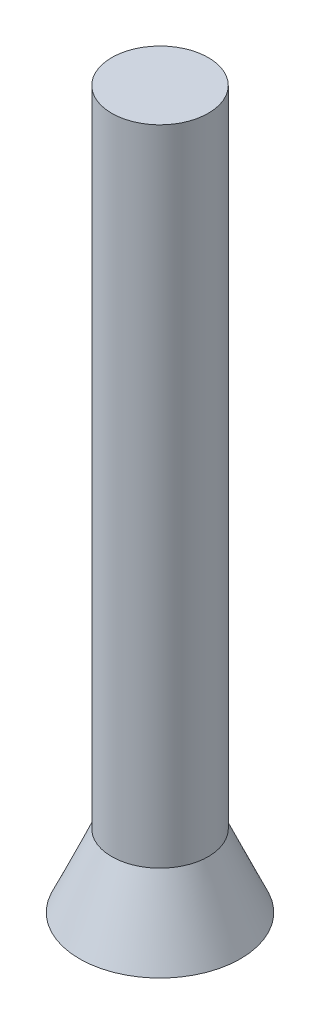
ISO-10303-21;
HEADER;
FILE_DESCRIPTION(('STEP AP214'),'2;1');
FILE_NAME('part.step','',(''),(''),'','','');
FILE_SCHEMA(('AUTOMOTIVE_DESIGN { 1 0 10303 214 1 1 1 1 }'));
ENDSEC;
DATA;
#1=APPLICATION_CONTEXT('core data for automotive mechanical design processes');
#2=APPLICATION_PROTOCOL_DEFINITION('international standard','automotive_design',2000,#1);
#3=PRODUCT_CONTEXT('',#1,'mechanical');
#4=PRODUCT('Part','Part','',(#3));
#5=PRODUCT_RELATED_PRODUCT_CATEGORY('part','',(#4));
#6=PRODUCT_DEFINITION_FORMATION('','',#4);
#7=PRODUCT_DEFINITION_CONTEXT('part definition',#1,'design');
#8=PRODUCT_DEFINITION('design','',#6,#7);
#9=PRODUCT_DEFINITION_SHAPE('','',#8);
#10=(LENGTH_UNIT() NAMED_UNIT(*) SI_UNIT(.MILLI.,.METRE.));
#11=(NAMED_UNIT(*) PLANE_ANGLE_UNIT() SI_UNIT($,.RADIAN.));
#12=(NAMED_UNIT(*) SI_UNIT($,.STERADIAN.) SOLID_ANGLE_UNIT());
#13=UNCERTAINTY_MEASURE_WITH_UNIT(LENGTH_MEASURE(1.E-05),#10,'distance_accuracy_value','');
#14=(GEOMETRIC_REPRESENTATION_CONTEXT(3) GLOBAL_UNCERTAINTY_ASSIGNED_CONTEXT((#13)) GLOBAL_UNIT_ASSIGNED_CONTEXT((#10,
#11,#12)) REPRESENTATION_CONTEXT('',''));
#15=CARTESIAN_POINT('',(0.,0.,0.));
#16=DIRECTION('',(0.,0.,1.));
#17=DIRECTION('',(1.,0.,0.));
#18=AXIS2_PLACEMENT_3D('',#15,#16,#17);
#19=CARTESIAN_POINT('',(0.,0.,0.));
#20=DIRECTION('',(0.,-1.,0.));
#21=DIRECTION('',(0.,0.,1.));
#22=AXIS2_PLACEMENT_3D('',#19,#20,#21);
#23=CONICAL_SURFACE('',#22,2.5,0.41887902047864);
#24=CARTESIAN_POINT('',(0.,2.25,0.));
#25=DIRECTION('',(0.,1.,0.));
#26=DIRECTION('',(0.,0.,1.));
#27=AXIS2_PLACEMENT_3D('',#24,#25,#26);
#28=CIRCLE('',#27,1.5);
#29=CARTESIAN_POINT('',(0.,2.25,1.5));
#30=VERTEX_POINT('',#29);
#31=EDGE_CURVE('E11',#30,#30,#28,.T.);
#32=ORIENTED_EDGE('',*,*,#31,.F.);
#33=EDGE_LOOP('',(#32));
#34=FACE_BOUND('',#33,.T.);
#35=CARTESIAN_POINT('',(0.,0.,0.));
#36=DIRECTION('',(0.,1.,0.));
#37=DIRECTION('',(0.,0.,1.));
#38=AXIS2_PLACEMENT_3D('',#35,#36,#37);
#39=CIRCLE('',#38,2.5);
#40=CARTESIAN_POINT('',(0.,0.,2.5));
#41=VERTEX_POINT('',#40);
#42=EDGE_CURVE('E43',#41,#41,#39,.T.);
#43=ORIENTED_EDGE('',*,*,#42,.T.);
#44=EDGE_LOOP('',(#43));
#45=FACE_BOUND('',#44,.T.);
#46=ADVANCED_FACE('F33',(#34,#45),#23,.T.);
#47=CARTESIAN_POINT('',(0.,0.,0.));
#48=DIRECTION('',(0.,1.,0.));
#49=DIRECTION('',(0.,0.,1.));
#50=AXIS2_PLACEMENT_3D('',#47,#48,#49);
#51=PLANE('',#50);
#52=DIRECTION('',(0.,0.,1.));
#53=VECTOR('',#52,1.);
#54=CARTESIAN_POINT('',(0.5,0.,-0.5));
#55=LINE('',#54,#53);
#56=CARTESIAN_POINT('',(0.5,0.,-2.));
#57=VERTEX_POINT('',#56);
#58=CARTESIAN_POINT('',(0.5,0.,-0.5));
#59=VERTEX_POINT('',#58);
#60=EDGE_CURVE('E142',#57,#59,#55,.T.);
#61=ORIENTED_EDGE('',*,*,#60,.F.);
#62=DIRECTION('',(1.,0.,0.));
#63=VECTOR('',#62,1.);
#64=CARTESIAN_POINT('',(-0.5,0.,-2.));
#65=LINE('',#64,#63);
#66=CARTESIAN_POINT('',(-0.5,0.,-2.));
#67=VERTEX_POINT('',#66);
#68=EDGE_CURVE('E50',#67,#57,#65,.T.);
#69=ORIENTED_EDGE('',*,*,#68,.F.);
#70=DIRECTION('',(0.,0.,-1.));
#71=VECTOR('',#70,1.);
#72=CARTESIAN_POINT('',(-0.5,0.,-0.5));
#73=LINE('',#72,#71);
#74=CARTESIAN_POINT('',(-0.5,0.,-0.5));
#75=VERTEX_POINT('',#74);
#76=EDGE_CURVE('E175',#75,#67,#73,.T.);
#77=ORIENTED_EDGE('',*,*,#76,.F.);
#78=DIRECTION('',(1.,0.,0.));
#79=VECTOR('',#78,1.);
#80=CARTESIAN_POINT('',(-2.,0.,-0.5));
#81=LINE('',#80,#79);
#82=CARTESIAN_POINT('',(-2.,0.,-0.5));
#83=VERTEX_POINT('',#82);
#84=EDGE_CURVE('E173',#83,#75,#81,.T.);
#85=ORIENTED_EDGE('',*,*,#84,.F.);
#86=DIRECTION('',(0.,0.,-1.));
#87=VECTOR('',#86,1.);
#88=CARTESIAN_POINT('',(-2.,0.,0.5));
#89=LINE('',#88,#87);
#90=CARTESIAN_POINT('',(-2.,0.,0.5));
#91=VERTEX_POINT('',#90);
#92=EDGE_CURVE('E170',#91,#83,#89,.T.);
#93=ORIENTED_EDGE('',*,*,#92,.F.);
#94=DIRECTION('',(-1.,0.,0.));
#95=VECTOR('',#94,1.);
#96=CARTESIAN_POINT('',(-2.,0.,0.5));
#97=LINE('',#96,#95);
#98=CARTESIAN_POINT('',(-0.5,0.,0.5));
#99=VERTEX_POINT('',#98);
#100=EDGE_CURVE('E167',#99,#91,#97,.T.);
#101=ORIENTED_EDGE('',*,*,#100,.F.);
#102=DIRECTION('',(0.,0.,-1.));
#103=VECTOR('',#102,1.);
#104=CARTESIAN_POINT('',(-0.5,0.,2.));
#105=LINE('',#104,#103);
#106=CARTESIAN_POINT('',(-0.5,0.,2.));
#107=VERTEX_POINT('',#106);
#108=EDGE_CURVE('E164',#107,#99,#105,.T.);
#109=ORIENTED_EDGE('',*,*,#108,.F.);
#110=DIRECTION('',(-1.,0.,0.));
#111=VECTOR('',#110,1.);
#112=CARTESIAN_POINT('',(-0.5,0.,2.));
#113=LINE('',#112,#111);
#114=CARTESIAN_POINT('',(0.5,0.,2.));
#115=VERTEX_POINT('',#114);
#116=EDGE_CURVE('E161',#115,#107,#113,.T.);
#117=ORIENTED_EDGE('',*,*,#116,.F.);
#118=DIRECTION('',(0.,0.,1.));
#119=VECTOR('',#118,1.);
#120=CARTESIAN_POINT('',(0.5,0.,2.));
#121=LINE('',#120,#119);
#122=CARTESIAN_POINT('',(0.5,0.,0.5));
#123=VERTEX_POINT('',#122);
#124=EDGE_CURVE('E158',#123,#115,#121,.T.);
#125=ORIENTED_EDGE('',*,*,#124,.F.);
#126=DIRECTION('',(-1.,0.,0.));
#127=VECTOR('',#126,1.);
#128=CARTESIAN_POINT('',(0.5,0.,0.5));
#129=LINE('',#128,#127);
#130=CARTESIAN_POINT('',(2.,0.,0.5));
#131=VERTEX_POINT('',#130);
#132=EDGE_CURVE('E152',#131,#123,#129,.T.);
#133=ORIENTED_EDGE('',*,*,#132,.F.);
#134=DIRECTION('',(0.,0.,1.));
#135=VECTOR('',#134,1.);
#136=CARTESIAN_POINT('',(2.,0.,0.5));
#137=LINE('',#136,#135);
#138=CARTESIAN_POINT('',(2.,0.,-0.5));
#139=VERTEX_POINT('',#138);
#140=EDGE_CURVE('E150',#139,#131,#137,.T.);
#141=ORIENTED_EDGE('',*,*,#140,.F.);
#142=DIRECTION('',(1.,0.,0.));
#143=VECTOR('',#142,1.);
#144=CARTESIAN_POINT('',(0.5,0.,-0.5));
#145=LINE('',#144,#143);
#146=EDGE_CURVE('E133',#59,#139,#145,.T.);
#147=ORIENTED_EDGE('',*,*,#146,.F.);
#148=EDGE_LOOP('',(#61,#69,#77,#85,#93,#101,#109,#117,#125,#133,#141,#147));
#149=FACE_BOUND('',#148,.T.);
#150=ORIENTED_EDGE('',*,*,#42,.F.);
#151=EDGE_LOOP('',(#150));
#152=FACE_BOUND('',#151,.T.);
#153=ADVANCED_FACE('F146',(#149,#152),#51,.F.);
#154=CARTESIAN_POINT('',(0.,22.25,0.));
#155=DIRECTION('',(0.,-1.,0.));
#156=DIRECTION('',(0.,0.,-1.));
#157=AXIS2_PLACEMENT_3D('',#154,#155,#156);
#158=CYLINDRICAL_SURFACE('',#157,1.5);
#159=CARTESIAN_POINT('',(0.,22.25,0.));
#160=DIRECTION('',(0.,1.,0.));
#161=DIRECTION('',(0.,0.,1.));
#162=AXIS2_PLACEMENT_3D('',#159,#160,#161);
#163=CIRCLE('',#162,1.5);
#164=CARTESIAN_POINT('',(0.,22.25,1.5));
#165=VERTEX_POINT('',#164);
#166=EDGE_CURVE('E179',#165,#165,#163,.T.);
#167=ORIENTED_EDGE('',*,*,#166,.F.);
#168=EDGE_LOOP('',(#167));
#169=FACE_BOUND('',#168,.T.);
#170=ORIENTED_EDGE('',*,*,#31,.T.);
#171=EDGE_LOOP('',(#170));
#172=FACE_BOUND('',#171,.T.);
#173=ADVANCED_FACE('F238',(#169,#172),#158,.T.);
#174=CARTESIAN_POINT('',(0.,22.25,0.));
#175=DIRECTION('',(0.,1.,0.));
#176=DIRECTION('',(0.,0.,1.));
#177=AXIS2_PLACEMENT_3D('',#174,#175,#176);
#178=PLANE('',#177);
#179=ORIENTED_EDGE('',*,*,#166,.T.);
#180=EDGE_LOOP('',(#179));
#181=FACE_BOUND('',#180,.T.);
#182=ADVANCED_FACE('F247',(#181),#178,.T.);
#183=CARTESIAN_POINT('',(-0.5,0.,-2.));
#184=DIRECTION('',(0.,0.284015344703923,-0.958819734868193));
#185=DIRECTION('',(0.,0.958819734868193,0.284015344703923));
#186=AXIS2_PLACEMENT_3D('',#183,#184,#185);
#187=PLANE('',#186);
#188=ORIENTED_EDGE('',*,*,#68,.T.);
#189=DIRECTION('',(0.273209828505095,-0.922340923529056,-0.273209828505095));
#190=VECTOR('',#189,1.);
#191=CARTESIAN_POINT('',(0.425356389608217,0.251992605540605,-1.92535638960822));
#192=LINE('',#191,#190);
#193=CARTESIAN_POINT('',(0.0556797575568785,1.5,-1.55567975755688));
#194=VERTEX_POINT('',#193);
#195=EDGE_CURVE('E93',#194,#57,#192,.T.);
#196=ORIENTED_EDGE('',*,*,#195,.F.);
#197=DIRECTION('',(1.,0.,0.));
#198=VECTOR('',#197,1.);
#199=CARTESIAN_POINT('',(-0.5,1.5,-1.55567975755688));
#200=LINE('',#199,#198);
#201=CARTESIAN_POINT('',(-0.0556797575568784,1.5,-1.55567975755688));
#202=VERTEX_POINT('',#201);
#203=EDGE_CURVE('E177',#202,#194,#200,.T.);
#204=ORIENTED_EDGE('',*,*,#203,.F.);
#205=DIRECTION('',(-0.273209828505095,-0.922340923529056,-0.273209828505095));
#206=VECTOR('',#205,1.);
#207=CARTESIAN_POINT('',(-0.388034584412325,0.377988908310907,-1.88803458441232));
#208=LINE('',#207,#206);
#209=EDGE_CURVE('E58',#202,#67,#208,.T.);
#210=ORIENTED_EDGE('',*,*,#209,.T.);
#211=EDGE_LOOP('',(#188,#196,#204,#210));
#212=FACE_BOUND('',#211,.T.);
#213=ADVANCED_FACE('F275',(#212),#187,.F.);
#214=CARTESIAN_POINT('',(-0.5,0.,-0.5));
#215=DIRECTION('',(-0.958819734868193,0.284015344703923,0.));
#216=DIRECTION('',(-0.284015344703923,-0.958819734868193,0.));
#217=AXIS2_PLACEMENT_3D('',#214,#215,#216);
#218=PLANE('',#217);
#219=ORIENTED_EDGE('',*,*,#76,.T.);
#220=ORIENTED_EDGE('',*,*,#209,.F.);
#221=DIRECTION('',(0.,0.,-1.));
#222=VECTOR('',#221,1.);
#223=CARTESIAN_POINT('',(-0.0556797575568785,1.5,-0.5));
#224=LINE('',#223,#222);
#225=CARTESIAN_POINT('',(-0.0556797575568785,1.5,-0.0556797575568784));
#226=VERTEX_POINT('',#225);
#227=EDGE_CURVE('E180',#226,#202,#224,.T.);
#228=ORIENTED_EDGE('',*,*,#227,.F.);
#229=DIRECTION('',(-0.273209828505095,-0.922340923529056,-0.273209828505095));
#230=VECTOR('',#229,1.);
#231=CARTESIAN_POINT('',(-0.5,0.,-0.5));
#232=LINE('',#231,#230);
#233=EDGE_CURVE('E98',#226,#75,#232,.T.);
#234=ORIENTED_EDGE('',*,*,#233,.T.);
#235=EDGE_LOOP('',(#219,#220,#228,#234));
#236=FACE_BOUND('',#235,.T.);
#237=ADVANCED_FACE('F288',(#236),#218,.F.);
#238=CARTESIAN_POINT('',(-2.,0.,-0.5));
#239=DIRECTION('',(0.,0.284015344703923,-0.958819734868193));
#240=DIRECTION('',(0.,0.958819734868193,0.284015344703923));
#241=AXIS2_PLACEMENT_3D('',#238,#239,#240);
#242=PLANE('',#241);
#243=ORIENTED_EDGE('',*,*,#84,.T.);
#244=ORIENTED_EDGE('',*,*,#233,.F.);
#245=DIRECTION('',(1.,0.,0.));
#246=VECTOR('',#245,1.);
#247=CARTESIAN_POINT('',(-2.,1.5,-0.0556797575568787));
#248=LINE('',#247,#246);
#249=CARTESIAN_POINT('',(-1.55567975755688,1.5,-0.0556797575568787));
#250=VERTEX_POINT('',#249);
#251=EDGE_CURVE('E203',#250,#226,#248,.T.);
#252=ORIENTED_EDGE('',*,*,#251,.F.);
#253=DIRECTION('',(-0.273209828505095,-0.922340923529056,-0.273209828505095));
#254=VECTOR('',#253,1.);
#255=CARTESIAN_POINT('',(-1.92535638960822,0.251992605540605,-0.425356389608217));
#256=LINE('',#255,#254);
#257=EDGE_CURVE('E195',#250,#83,#256,.T.);
#258=ORIENTED_EDGE('',*,*,#257,.T.);
#259=EDGE_LOOP('',(#243,#244,#252,#258));
#260=FACE_BOUND('',#259,.T.);
#261=ADVANCED_FACE('F297',(#260),#242,.F.);
#262=CARTESIAN_POINT('',(-2.,0.,0.5));
#263=DIRECTION('',(-0.958819734868193,0.284015344703923,0.));
#264=DIRECTION('',(-0.284015344703923,-0.958819734868193,0.));
#265=AXIS2_PLACEMENT_3D('',#262,#263,#264);
#266=PLANE('',#265);
#267=ORIENTED_EDGE('',*,*,#92,.T.);
#268=ORIENTED_EDGE('',*,*,#257,.F.);
#269=DIRECTION('',(0.,0.,-1.));
#270=VECTOR('',#269,1.);
#271=CARTESIAN_POINT('',(-1.55567975755688,1.5,0.5));
#272=LINE('',#271,#270);
#273=CARTESIAN_POINT('',(-1.55567975755688,1.5,0.0556797575568783));
#274=VERTEX_POINT('',#273);
#275=EDGE_CURVE('E206',#274,#250,#272,.T.);
#276=ORIENTED_EDGE('',*,*,#275,.F.);
#277=DIRECTION('',(-0.273209828505095,-0.922340923529056,0.273209828505095));
#278=VECTOR('',#277,1.);
#279=CARTESIAN_POINT('',(-2.,0.,0.5));
#280=LINE('',#279,#278);
#281=EDGE_CURVE('E193',#274,#91,#280,.T.);
#282=ORIENTED_EDGE('',*,*,#281,.T.);
#283=EDGE_LOOP('',(#267,#268,#276,#282));
#284=FACE_BOUND('',#283,.T.);
#285=ADVANCED_FACE('F305',(#284),#266,.F.);
#286=CARTESIAN_POINT('',(-2.,0.,0.5));
#287=DIRECTION('',(0.,0.284015344703923,0.958819734868193));
#288=DIRECTION('',(0.,-0.958819734868193,0.284015344703923));
#289=AXIS2_PLACEMENT_3D('',#286,#287,#288);
#290=PLANE('',#289);
#291=ORIENTED_EDGE('',*,*,#100,.T.);
#292=ORIENTED_EDGE('',*,*,#281,.F.);
#293=DIRECTION('',(-1.,0.,0.));
#294=VECTOR('',#293,1.);
#295=CARTESIAN_POINT('',(-2.,1.5,0.0556797575568783));
#296=LINE('',#295,#294);
#297=CARTESIAN_POINT('',(-0.0556797575568785,1.5,0.0556797575568785));
#298=VERTEX_POINT('',#297);
#299=EDGE_CURVE('E209',#298,#274,#296,.T.);
#300=ORIENTED_EDGE('',*,*,#299,.F.);
#301=DIRECTION('',(-0.273209828505095,-0.922340923529056,0.273209828505095));
#302=VECTOR('',#301,1.);
#303=CARTESIAN_POINT('',(-0.611965415587675,-0.377988908310907,0.611965415587675));
#304=LINE('',#303,#302);
#305=EDGE_CURVE('E191',#298,#99,#304,.T.);
#306=ORIENTED_EDGE('',*,*,#305,.T.);
#307=EDGE_LOOP('',(#291,#292,#300,#306));
#308=FACE_BOUND('',#307,.T.);
#309=ADVANCED_FACE('F315',(#308),#290,.F.);
#310=CARTESIAN_POINT('',(-0.5,0.,2.));
#311=DIRECTION('',(-0.958819734868193,0.284015344703923,0.));
#312=DIRECTION('',(-0.284015344703923,-0.958819734868193,0.));
#313=AXIS2_PLACEMENT_3D('',#310,#311,#312);
#314=PLANE('',#313);
#315=ORIENTED_EDGE('',*,*,#108,.T.);
#316=ORIENTED_EDGE('',*,*,#305,.F.);
#317=DIRECTION('',(0.,0.,-1.));
#318=VECTOR('',#317,1.);
#319=CARTESIAN_POINT('',(-0.0556797575568784,1.5,2.));
#320=LINE('',#319,#318);
#321=CARTESIAN_POINT('',(-0.0556797575568784,1.5,1.55567975755688));
#322=VERTEX_POINT('',#321);
#323=EDGE_CURVE('E212',#322,#298,#320,.T.);
#324=ORIENTED_EDGE('',*,*,#323,.F.);
#325=DIRECTION('',(-0.273209828505095,-0.922340923529056,0.273209828505095));
#326=VECTOR('',#325,1.);
#327=CARTESIAN_POINT('',(-0.5,0.,2.));
#328=LINE('',#327,#326);
#329=EDGE_CURVE('E189',#322,#107,#328,.T.);
#330=ORIENTED_EDGE('',*,*,#329,.T.);
#331=EDGE_LOOP('',(#315,#316,#324,#330));
#332=FACE_BOUND('',#331,.T.);
#333=ADVANCED_FACE('F325',(#332),#314,.F.);
#334=CARTESIAN_POINT('',(-0.5,0.,2.));
#335=DIRECTION('',(0.,0.284015344703923,0.958819734868193));
#336=DIRECTION('',(0.,-0.958819734868193,0.284015344703923));
#337=AXIS2_PLACEMENT_3D('',#334,#335,#336);
#338=PLANE('',#337);
#339=ORIENTED_EDGE('',*,*,#116,.T.);
#340=ORIENTED_EDGE('',*,*,#329,.F.);
#341=DIRECTION('',(-1.,0.,0.));
#342=VECTOR('',#341,1.);
#343=CARTESIAN_POINT('',(-0.5,1.5,1.55567975755688));
#344=LINE('',#343,#342);
#345=CARTESIAN_POINT('',(0.0556797575568785,1.5,1.55567975755688));
#346=VERTEX_POINT('',#345);
#347=EDGE_CURVE('E215',#346,#322,#344,.T.);
#348=ORIENTED_EDGE('',*,*,#347,.F.);
#349=DIRECTION('',(0.273209828505095,-0.922340923529056,0.273209828505095));
#350=VECTOR('',#349,1.);
#351=CARTESIAN_POINT('',(0.5,0.,2.));
#352=LINE('',#351,#350);
#353=EDGE_CURVE('E187',#346,#115,#352,.T.);
#354=ORIENTED_EDGE('',*,*,#353,.T.);
#355=EDGE_LOOP('',(#339,#340,#348,#354));
#356=FACE_BOUND('',#355,.T.);
#357=ADVANCED_FACE('F335',(#356),#338,.F.);
#358=CARTESIAN_POINT('',(0.5,0.,2.));
#359=DIRECTION('',(0.958819734868193,0.284015344703923,0.));
#360=DIRECTION('',(-0.284015344703923,0.958819734868193,0.));
#361=AXIS2_PLACEMENT_3D('',#358,#359,#360);
#362=PLANE('',#361);
#363=ORIENTED_EDGE('',*,*,#124,.T.);
#364=ORIENTED_EDGE('',*,*,#353,.F.);
#365=DIRECTION('',(0.,0.,1.));
#366=VECTOR('',#365,1.);
#367=CARTESIAN_POINT('',(0.0556797575568786,1.5,2.));
#368=LINE('',#367,#366);
#369=CARTESIAN_POINT('',(0.0556797575568782,1.5,0.0556797575568784));
#370=VERTEX_POINT('',#369);
#371=EDGE_CURVE('E218',#370,#346,#368,.T.);
#372=ORIENTED_EDGE('',*,*,#371,.F.);
#373=DIRECTION('',(0.273209828505095,-0.922340923529057,0.273209828505095));
#374=VECTOR('',#373,1.);
#375=CARTESIAN_POINT('',(0.611965415587675,-0.377988908310907,0.611965415587676));
#376=LINE('',#375,#374);
#377=EDGE_CURVE('E185',#370,#123,#376,.T.);
#378=ORIENTED_EDGE('',*,*,#377,.T.);
#379=EDGE_LOOP('',(#363,#364,#372,#378));
#380=FACE_BOUND('',#379,.T.);
#381=ADVANCED_FACE('F345',(#380),#362,.F.);
#382=CARTESIAN_POINT('',(0.5,0.,0.5));
#383=DIRECTION('',(0.,0.284015344703923,0.958819734868193));
#384=DIRECTION('',(0.,-0.958819734868193,0.284015344703923));
#385=AXIS2_PLACEMENT_3D('',#382,#383,#384);
#386=PLANE('',#385);
#387=ORIENTED_EDGE('',*,*,#132,.T.);
#388=ORIENTED_EDGE('',*,*,#377,.F.);
#389=DIRECTION('',(-1.,0.,0.));
#390=VECTOR('',#389,1.);
#391=CARTESIAN_POINT('',(0.5,1.5,0.0556797575568784));
#392=LINE('',#391,#390);
#393=CARTESIAN_POINT('',(1.55567975755688,1.5,0.0556797575568786));
#394=VERTEX_POINT('',#393);
#395=EDGE_CURVE('E221',#394,#370,#392,.T.);
#396=ORIENTED_EDGE('',*,*,#395,.F.);
#397=DIRECTION('',(0.273209828505095,-0.922340923529057,0.273209828505095));
#398=VECTOR('',#397,1.);
#399=CARTESIAN_POINT('',(2.,0.,0.5));
#400=LINE('',#399,#398);
#401=EDGE_CURVE('E183',#394,#131,#400,.T.);
#402=ORIENTED_EDGE('',*,*,#401,.T.);
#403=EDGE_LOOP('',(#387,#388,#396,#402));
#404=FACE_BOUND('',#403,.T.);
#405=ADVANCED_FACE('F355',(#404),#386,.F.);
#406=CARTESIAN_POINT('',(2.,0.,0.5));
#407=DIRECTION('',(0.958819734868193,0.284015344703923,0.));
#408=DIRECTION('',(-0.284015344703923,0.958819734868193,0.));
#409=AXIS2_PLACEMENT_3D('',#406,#407,#408);
#410=PLANE('',#409);
#411=ORIENTED_EDGE('',*,*,#140,.T.);
#412=ORIENTED_EDGE('',*,*,#401,.F.);
#413=DIRECTION('',(0.,0.,1.));
#414=VECTOR('',#413,1.);
#415=CARTESIAN_POINT('',(1.55567975755688,1.5,0.5));
#416=LINE('',#415,#414);
#417=CARTESIAN_POINT('',(1.55567975755688,1.5,-0.0556797575568783));
#418=VERTEX_POINT('',#417);
#419=EDGE_CURVE('E224',#418,#394,#416,.T.);
#420=ORIENTED_EDGE('',*,*,#419,.F.);
#421=DIRECTION('',(0.273209828505095,-0.922340923529056,-0.273209828505095));
#422=VECTOR('',#421,1.);
#423=CARTESIAN_POINT('',(1.88803458441232,0.377988908310907,-0.388034584412324));
#424=LINE('',#423,#422);
#425=EDGE_CURVE('E139',#418,#139,#424,.T.);
#426=ORIENTED_EDGE('',*,*,#425,.T.);
#427=EDGE_LOOP('',(#411,#412,#420,#426));
#428=FACE_BOUND('',#427,.T.);
#429=ADVANCED_FACE('F365',(#428),#410,.F.);
#430=CARTESIAN_POINT('',(0.5,0.,-0.5));
#431=DIRECTION('',(0.,0.284015344703923,-0.958819734868193));
#432=DIRECTION('',(0.,0.958819734868193,0.284015344703923));
#433=AXIS2_PLACEMENT_3D('',#430,#431,#432);
#434=PLANE('',#433);
#435=ORIENTED_EDGE('',*,*,#146,.T.);
#436=ORIENTED_EDGE('',*,*,#425,.F.);
#437=DIRECTION('',(1.,0.,0.));
#438=VECTOR('',#437,1.);
#439=CARTESIAN_POINT('',(0.5,1.5,-0.0556797575568785));
#440=LINE('',#439,#438);
#441=CARTESIAN_POINT('',(0.0556797575568784,1.5,-0.0556797575568785));
#442=VERTEX_POINT('',#441);
#443=EDGE_CURVE('E136',#442,#418,#440,.T.);
#444=ORIENTED_EDGE('',*,*,#443,.F.);
#445=DIRECTION('',(0.273209828505095,-0.922340923529056,-0.273209828505095));
#446=VECTOR('',#445,1.);
#447=CARTESIAN_POINT('',(0.5,0.,-0.5));
#448=LINE('',#447,#446);
#449=EDGE_CURVE('E129',#442,#59,#448,.T.);
#450=ORIENTED_EDGE('',*,*,#449,.T.);
#451=EDGE_LOOP('',(#435,#436,#444,#450));
#452=FACE_BOUND('',#451,.T.);
#453=ADVANCED_FACE('F131',(#452),#434,.F.);
#454=CARTESIAN_POINT('',(0.5,0.,-0.5));
#455=DIRECTION('',(0.958819734868193,0.284015344703923,0.));
#456=DIRECTION('',(-0.284015344703923,0.958819734868193,0.));
#457=AXIS2_PLACEMENT_3D('',#454,#455,#456);
#458=PLANE('',#457);
#459=ORIENTED_EDGE('',*,*,#60,.T.);
#460=ORIENTED_EDGE('',*,*,#449,.F.);
#461=DIRECTION('',(0.,0.,1.));
#462=VECTOR('',#461,1.);
#463=CARTESIAN_POINT('',(0.0556797575568785,1.5,-0.5));
#464=LINE('',#463,#462);
#465=EDGE_CURVE('E200',#194,#442,#464,.T.);
#466=ORIENTED_EDGE('',*,*,#465,.F.);
#467=ORIENTED_EDGE('',*,*,#195,.T.);
#468=EDGE_LOOP('',(#459,#460,#466,#467));
#469=FACE_BOUND('',#468,.T.);
#470=ADVANCED_FACE('F143',(#469),#458,.F.);
#471=CARTESIAN_POINT('',(0.,1.5,0.));
#472=DIRECTION('',(0.,1.,0.));
#473=DIRECTION('',(0.,0.,1.));
#474=AXIS2_PLACEMENT_3D('',#471,#472,#473);
#475=PLANE('',#474);
#476=ORIENTED_EDGE('',*,*,#203,.T.);
#477=ORIENTED_EDGE('',*,*,#465,.T.);
#478=ORIENTED_EDGE('',*,*,#443,.T.);
#479=ORIENTED_EDGE('',*,*,#419,.T.);
#480=ORIENTED_EDGE('',*,*,#395,.T.);
#481=ORIENTED_EDGE('',*,*,#371,.T.);
#482=ORIENTED_EDGE('',*,*,#347,.T.);
#483=ORIENTED_EDGE('',*,*,#323,.T.);
#484=ORIENTED_EDGE('',*,*,#299,.T.);
#485=ORIENTED_EDGE('',*,*,#275,.T.);
#486=ORIENTED_EDGE('',*,*,#251,.T.);
#487=ORIENTED_EDGE('',*,*,#227,.T.);
#488=EDGE_LOOP('',(#476,#477,#478,#479,#480,#481,#482,#483,#484,#485,#486,#487));
#489=FACE_BOUND('',#488,.T.);
#490=ADVANCED_FACE('F392',(#489),#475,.F.);
#491=CLOSED_SHELL('',(#46,#153,#173,#182,#213,#237,#261,#285,#309,#333,#357,#381,#405,#429,#453,
#470,#490));
#492=MANIFOLD_SOLID_BREP('B2',#491);
#493=ADVANCED_BREP_SHAPE_REPRESENTATION('',(#18,#492),#14);
#494=SHAPE_DEFINITION_REPRESENTATION(#9,#493);
ENDSEC;
END-ISO-10303-21;
